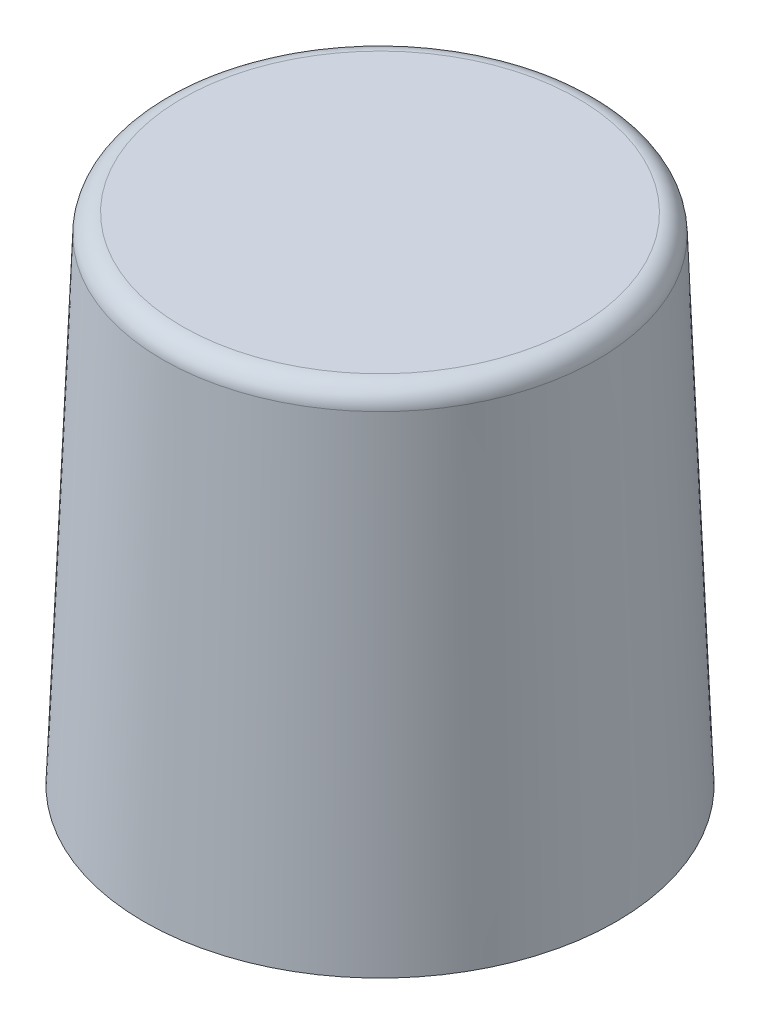
ISO-10303-21;
HEADER;
FILE_DESCRIPTION(('STEP AP214'),'2;1');
FILE_NAME('part.step','',(''),(''),'','','');
FILE_SCHEMA(('AUTOMOTIVE_DESIGN { 1 0 10303 214 1 1 1 1 }'));
ENDSEC;
DATA;
#1=APPLICATION_CONTEXT('core data for automotive mechanical design processes');
#2=APPLICATION_PROTOCOL_DEFINITION('international standard','automotive_design',2000,#1);
#3=PRODUCT_CONTEXT('',#1,'mechanical');
#4=PRODUCT('Part','Part','',(#3));
#5=PRODUCT_RELATED_PRODUCT_CATEGORY('part','',(#4));
#6=PRODUCT_DEFINITION_FORMATION('','',#4);
#7=PRODUCT_DEFINITION_CONTEXT('part definition',#1,'design');
#8=PRODUCT_DEFINITION('design','',#6,#7);
#9=PRODUCT_DEFINITION_SHAPE('','',#8);
#10=(LENGTH_UNIT() NAMED_UNIT(*) SI_UNIT(.MILLI.,.METRE.));
#11=(NAMED_UNIT(*) PLANE_ANGLE_UNIT() SI_UNIT($,.RADIAN.));
#12=(NAMED_UNIT(*) SI_UNIT($,.STERADIAN.) SOLID_ANGLE_UNIT());
#13=UNCERTAINTY_MEASURE_WITH_UNIT(LENGTH_MEASURE(1.E-05),#10,'distance_accuracy_value','');
#14=(GEOMETRIC_REPRESENTATION_CONTEXT(3) GLOBAL_UNCERTAINTY_ASSIGNED_CONTEXT((#13)) GLOBAL_UNIT_ASSIGNED_CONTEXT((#10,
#11,#12)) REPRESENTATION_CONTEXT('',''));
#15=CARTESIAN_POINT('',(0.,0.,0.));
#16=DIRECTION('',(0.,0.,1.));
#17=DIRECTION('',(1.,0.,0.));
#18=AXIS2_PLACEMENT_3D('',#15,#16,#17);
#19=CARTESIAN_POINT('',(0.,0.,0.));
#20=DIRECTION('',(0.,1.,0.));
#21=DIRECTION('',(0.,0.,1.));
#22=AXIS2_PLACEMENT_3D('',#19,#20,#21);
#23=PLANE('',#22);
#24=CARTESIAN_POINT('',(0.,0.,0.));
#25=DIRECTION('',(0.,1.,0.));
#26=DIRECTION('',(0.,0.,1.));
#27=AXIS2_PLACEMENT_3D('',#24,#25,#26);
#28=CIRCLE('',#27,2.50972387435562);
#29=CARTESIAN_POINT('',(0.,0.,2.50972387435562));
#30=VERTEX_POINT('',#29);
#31=EDGE_CURVE('E10',#30,#30,#28,.T.);
#32=ORIENTED_EDGE('',*,*,#31,.T.);
#33=EDGE_LOOP('',(#32));
#34=FACE_BOUND('',#33,.T.);
#35=ADVANCED_FACE('F31',(#34),#23,.T.);
#36=CARTESIAN_POINT('',(0.,-6.3,0.));
#37=DIRECTION('',(0.,-1.,0.));
#38=DIRECTION('',(0.,0.,-1.));
#39=AXIS2_PLACEMENT_3D('',#36,#37,#38);
#40=CONICAL_SURFACE('',#39,3.,0.0396617299231276);
#41=CARTESIAN_POINT('',(0.,-0.24008716689794,0.));
#42=DIRECTION('',(0.,1.,0.));
#43=DIRECTION('',(0.,0.,1.));
#44=AXIS2_PLACEMENT_3D('',#41,#42,#43);
#45=CIRCLE('',#44,2.7595272685277);
#46=CARTESIAN_POINT('',(0.,-0.24008716689794,2.7595272685277));
#47=VERTEX_POINT('',#46);
#48=EDGE_CURVE('E38',#47,#47,#45,.F.);
#49=ORIENTED_EDGE('',*,*,#48,.T.);
#50=EDGE_LOOP('',(#49));
#51=FACE_BOUND('',#50,.T.);
#52=CARTESIAN_POINT('',(0.,-6.3,0.));
#53=DIRECTION('',(0.,-1.,0.));
#54=DIRECTION('',(0.,0.,-1.));
#55=AXIS2_PLACEMENT_3D('',#52,#53,#54);
#56=CIRCLE('',#55,3.);
#57=CARTESIAN_POINT('',(0.,-6.3,-3.));
#58=VERTEX_POINT('',#57);
#59=EDGE_CURVE('E42',#58,#58,#56,.T.);
#60=ORIENTED_EDGE('',*,*,#59,.F.);
#61=EDGE_LOOP('',(#60));
#62=FACE_BOUND('',#61,.T.);
#63=ADVANCED_FACE('F67',(#51,#62),#40,.T.);
#64=CARTESIAN_POINT('',(3.,-6.3,0.));
#65=DIRECTION('',(0.,-1.,0.));
#66=DIRECTION('',(0.,0.,-1.));
#67=AXIS2_PLACEMENT_3D('',#64,#65,#66);
#68=PLANE('',#67);
#69=ORIENTED_EDGE('',*,*,#59,.T.);
#70=EDGE_LOOP('',(#69));
#71=FACE_BOUND('',#70,.T.);
#72=CARTESIAN_POINT('',(0.,-6.3,0.));
#73=DIRECTION('',(0.,-1.,0.));
#74=DIRECTION('',(0.,0.,-1.));
#75=AXIS2_PLACEMENT_3D('',#72,#73,#74);
#76=CIRCLE('',#75,1.5);
#77=CARTESIAN_POINT('',(0.,-6.3,-1.5));
#78=VERTEX_POINT('',#77);
#79=EDGE_CURVE('E46',#78,#78,#76,.T.);
#80=ORIENTED_EDGE('',*,*,#79,.F.);
#81=EDGE_LOOP('',(#80));
#82=FACE_BOUND('',#81,.T.);
#83=ADVANCED_FACE('F59',(#71,#82),#68,.T.);
#84=CARTESIAN_POINT('',(0.,0.,0.));
#85=DIRECTION('',(0.,-1.,0.));
#86=DIRECTION('',(0.,0.,-1.));
#87=AXIS2_PLACEMENT_3D('',#84,#85,#86);
#88=CYLINDRICAL_SURFACE('',#87,1.5);
#89=ORIENTED_EDGE('',*,*,#79,.T.);
#90=EDGE_LOOP('',(#89));
#91=FACE_BOUND('',#90,.T.);
#92=CARTESIAN_POINT('',(0.,-0.3,0.));
#93=DIRECTION('',(0.,-1.,0.));
#94=DIRECTION('',(0.,0.,-1.));
#95=AXIS2_PLACEMENT_3D('',#92,#93,#94);
#96=CIRCLE('',#95,1.5);
#97=CARTESIAN_POINT('',(0.,-0.3,-1.5));
#98=VERTEX_POINT('',#97);
#99=EDGE_CURVE('E51',#98,#98,#96,.T.);
#100=ORIENTED_EDGE('',*,*,#99,.F.);
#101=EDGE_LOOP('',(#100));
#102=FACE_BOUND('',#101,.T.);
#103=ADVANCED_FACE('F57',(#91,#102),#88,.F.);
#104=CARTESIAN_POINT('',(1.5,-0.3,0.));
#105=DIRECTION('',(0.,-1.,0.));
#106=DIRECTION('',(0.,0.,-1.));
#107=AXIS2_PLACEMENT_3D('',#104,#105,#106);
#108=PLANE('',#107);
#109=ORIENTED_EDGE('',*,*,#99,.T.);
#110=EDGE_LOOP('',(#109));
#111=FACE_BOUND('',#110,.T.);
#112=ADVANCED_FACE('F55',(#111),#108,.T.);
#113=CARTESIAN_POINT('',(0.,-0.25,0.));
#114=DIRECTION('',(0.,1.,0.));
#115=DIRECTION('',(0.,0.,1.));
#116=AXIS2_PLACEMENT_3D('',#113,#114,#115);
#117=TOROIDAL_SURFACE('',#116,2.50972387435562,0.25);
#118=ORIENTED_EDGE('',*,*,#31,.F.);
#119=EDGE_LOOP('',(#118));
#120=FACE_BOUND('',#119,.T.);
#121=ORIENTED_EDGE('',*,*,#48,.F.);
#122=EDGE_LOOP('',(#121));
#123=FACE_BOUND('',#122,.T.);
#124=ADVANCED_FACE('F33',(#120,#123),#117,.T.);
#125=CLOSED_SHELL('',(#35,#63,#83,#103,#112,#124));
#126=MANIFOLD_SOLID_BREP('B2',#125);
#127=ADVANCED_BREP_SHAPE_REPRESENTATION('',(#18,#126),#14);
#128=SHAPE_DEFINITION_REPRESENTATION(#9,#127);
ENDSEC;
END-ISO-10303-21;
